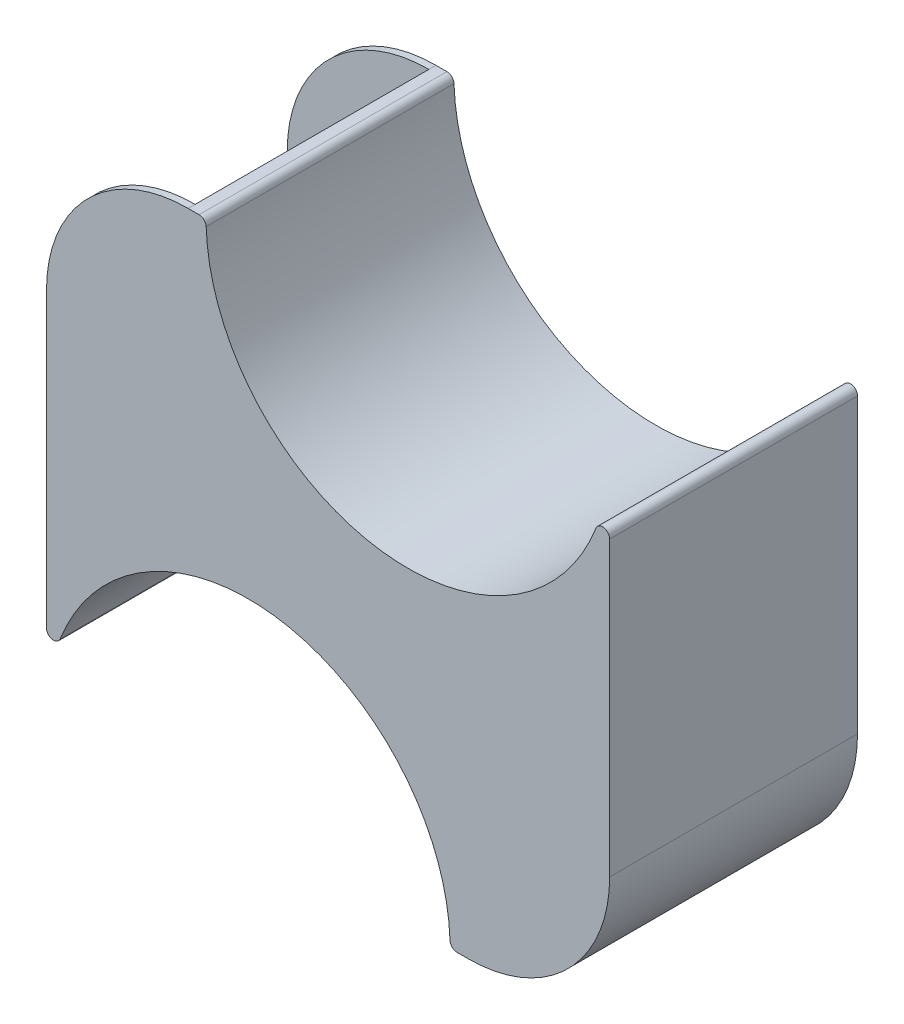
ISO-10303-21;
HEADER;
FILE_DESCRIPTION(('STEP AP214'),'2;1');
FILE_NAME('part.step','',(''),(''),'','','');
FILE_SCHEMA(('AUTOMOTIVE_DESIGN { 1 0 10303 214 1 1 1 1 }'));
ENDSEC;
DATA;
#1=APPLICATION_CONTEXT('core data for automotive mechanical design processes');
#2=APPLICATION_PROTOCOL_DEFINITION('international standard','automotive_design',2000,#1);
#3=PRODUCT_CONTEXT('',#1,'mechanical');
#4=PRODUCT('Part','Part','',(#3));
#5=PRODUCT_RELATED_PRODUCT_CATEGORY('part','',(#4));
#6=PRODUCT_DEFINITION_FORMATION('','',#4);
#7=PRODUCT_DEFINITION_CONTEXT('part definition',#1,'design');
#8=PRODUCT_DEFINITION('design','',#6,#7);
#9=PRODUCT_DEFINITION_SHAPE('','',#8);
#10=(LENGTH_UNIT() NAMED_UNIT(*) SI_UNIT(.MILLI.,.METRE.));
#11=(NAMED_UNIT(*) PLANE_ANGLE_UNIT() SI_UNIT($,.RADIAN.));
#12=(NAMED_UNIT(*) SI_UNIT($,.STERADIAN.) SOLID_ANGLE_UNIT());
#13=UNCERTAINTY_MEASURE_WITH_UNIT(LENGTH_MEASURE(1.E-05),#10,'distance_accuracy_value','');
#14=(GEOMETRIC_REPRESENTATION_CONTEXT(3) GLOBAL_UNCERTAINTY_ASSIGNED_CONTEXT((#13)) GLOBAL_UNIT_ASSIGNED_CONTEXT((#10,
#11,#12)) REPRESENTATION_CONTEXT('',''));
#15=CARTESIAN_POINT('',(0.,0.,0.));
#16=DIRECTION('',(0.,0.,1.));
#17=DIRECTION('',(1.,0.,0.));
#18=AXIS2_PLACEMENT_3D('',#15,#16,#17);
#19=CARTESIAN_POINT('',(-31.0300000000002,-20.,35.));
#20=DIRECTION('',(0.,0.,-1.));
#21=DIRECTION('',(-1.,0.,0.));
#22=AXIS2_PLACEMENT_3D('',#19,#20,#21);
#23=CYLINDRICAL_SURFACE('',#22,20.);
#24=DIRECTION('',(0.,0.,-1.));
#25=VECTOR('',#24,1.);
#26=CARTESIAN_POINT('',(-31.0300000000002,0.,35.));
#27=LINE('',#26,#25);
#28=CARTESIAN_POINT('',(-31.0300000000002,0.,34.));
#29=VERTEX_POINT('',#28);
#30=CARTESIAN_POINT('',(-31.0300000000002,0.,35.));
#31=VERTEX_POINT('',#30);
#32=EDGE_CURVE('E416',#29,#31,#27,.F.);
#33=ORIENTED_EDGE('',*,*,#32,.F.);
#34=CARTESIAN_POINT('',(-31.0300000000002,-20.,34.));
#35=DIRECTION('',(0.,0.,1.));
#36=DIRECTION('',(1.,0.,0.));
#37=AXIS2_PLACEMENT_3D('',#34,#35,#36);
#38=CIRCLE('',#37,20.);
#39=CARTESIAN_POINT('',(-51.0300000000002,-20.0000000000001,34.));
#40=VERTEX_POINT('',#39);
#41=EDGE_CURVE('E250',#29,#40,#38,.T.);
#42=ORIENTED_EDGE('',*,*,#41,.T.);
#43=DIRECTION('',(0.,0.,-1.));
#44=VECTOR('',#43,1.);
#45=CARTESIAN_POINT('',(-51.0300000000002,-20.0000000000001,35.));
#46=LINE('',#45,#44);
#47=CARTESIAN_POINT('',(-51.0300000000002,-20.0000000000001,35.));
#48=VERTEX_POINT('',#47);
#49=EDGE_CURVE('E406',#48,#40,#46,.T.);
#50=ORIENTED_EDGE('',*,*,#49,.F.);
#51=CARTESIAN_POINT('',(-31.0300000000002,-20.,35.));
#52=DIRECTION('',(0.,0.,1.));
#53=DIRECTION('',(1.,0.,0.));
#54=AXIS2_PLACEMENT_3D('',#51,#52,#53);
#55=CIRCLE('',#54,20.);
#56=EDGE_CURVE('E423',#31,#48,#55,.T.);
#57=ORIENTED_EDGE('',*,*,#56,.F.);
#58=EDGE_LOOP('',(#33,#42,#50,#57));
#59=FACE_BOUND('',#58,.T.);
#60=ADVANCED_FACE('F44',(#59),#23,.T.);
#61=CARTESIAN_POINT('',(-51.0300000000002,-20.0000000000001,1.));
#62=VERTEX_POINT('',#61);
#63=CARTESIAN_POINT('',(-51.0300000000002,-20.0000000000001,0.));
#64=VERTEX_POINT('',#63);
#65=EDGE_CURVE('E405',#62,#64,#46,.T.);
#66=ORIENTED_EDGE('',*,*,#65,.F.);
#67=CARTESIAN_POINT('',(-31.0300000000002,-20.,1.));
#68=DIRECTION('',(0.,0.,1.));
#69=DIRECTION('',(1.,0.,0.));
#70=AXIS2_PLACEMENT_3D('',#67,#68,#69);
#71=CIRCLE('',#70,20.);
#72=CARTESIAN_POINT('',(-31.0300000000002,0.,1.));
#73=VERTEX_POINT('',#72);
#74=EDGE_CURVE('E277',#62,#73,#71,.F.);
#75=ORIENTED_EDGE('',*,*,#74,.T.);
#76=CARTESIAN_POINT('',(-31.0300000000002,0.,0.));
#77=VERTEX_POINT('',#76);
#78=EDGE_CURVE('E417',#77,#73,#27,.F.);
#79=ORIENTED_EDGE('',*,*,#78,.F.);
#80=CARTESIAN_POINT('',(-31.0300000000002,-20.,0.));
#81=DIRECTION('',(0.,0.,1.));
#82=DIRECTION('',(1.,0.,0.));
#83=AXIS2_PLACEMENT_3D('',#80,#81,#82);
#84=CIRCLE('',#83,20.);
#85=EDGE_CURVE('E413',#64,#77,#84,.F.);
#86=ORIENTED_EDGE('',*,*,#85,.F.);
#87=EDGE_LOOP('',(#66,#75,#79,#86));
#88=FACE_BOUND('',#87,.T.);
#89=ADVANCED_FACE('F480',(#88),#23,.T.);
#90=CARTESIAN_POINT('',(0.,0.,35.));
#91=DIRECTION('',(0.,0.,-1.));
#92=DIRECTION('',(-1.,0.,0.));
#93=AXIS2_PLACEMENT_3D('',#90,#91,#92);
#94=CYLINDRICAL_SURFACE('',#93,28.5);
#95=CARTESIAN_POINT('',(0.,0.,0.));
#96=DIRECTION('',(0.,0.,-1.));
#97=DIRECTION('',(1.,0.,0.));
#98=AXIS2_PLACEMENT_3D('',#95,#96,#97);
#99=CIRCLE('',#98,28.5);
#100=CARTESIAN_POINT('',(26.5677966101695,-10.3151433960303,0.));
#101=VERTEX_POINT('',#100);
#102=CARTESIAN_POINT('',(-28.4836206883023,-0.966101694915254,0.));
#103=VERTEX_POINT('',#102);
#104=EDGE_CURVE('E290',#101,#103,#99,.T.);
#105=ORIENTED_EDGE('',*,*,#104,.T.);
#106=DIRECTION('',(0.,0.,-1.));
#107=VECTOR('',#106,1.);
#108=CARTESIAN_POINT('',(-28.4836206883023,-0.966101694915255,35.));
#109=LINE('',#108,#107);
#110=CARTESIAN_POINT('',(-28.4836206883023,-0.966101694915254,35.));
#111=VERTEX_POINT('',#110);
#112=EDGE_CURVE('E371',#103,#111,#109,.F.);
#113=ORIENTED_EDGE('',*,*,#112,.T.);
#114=CARTESIAN_POINT('',(0.,0.,35.));
#115=DIRECTION('',(0.,0.,-1.));
#116=DIRECTION('',(1.,0.,0.));
#117=AXIS2_PLACEMENT_3D('',#114,#115,#116);
#118=CIRCLE('',#117,28.5);
#119=CARTESIAN_POINT('',(26.5677966101695,-10.3151433960303,35.));
#120=VERTEX_POINT('',#119);
#121=EDGE_CURVE('E307',#120,#111,#118,.T.);
#122=ORIENTED_EDGE('',*,*,#121,.F.);
#123=DIRECTION('',(0.,0.,-1.));
#124=VECTOR('',#123,1.);
#125=CARTESIAN_POINT('',(26.5677966101695,-10.3151433960303,35.));
#126=LINE('',#125,#124);
#127=EDGE_CURVE('E367',#120,#101,#126,.T.);
#128=ORIENTED_EDGE('',*,*,#127,.T.);
#129=EDGE_LOOP('',(#105,#113,#122,#128));
#130=FACE_BOUND('',#129,.T.);
#131=ADVANCED_FACE('F446',(#130),#94,.F.);
#132=CARTESIAN_POINT('',(-28.5,0.,35.));
#133=DIRECTION('',(0.,-1.,0.));
#134=DIRECTION('',(1.,0.,0.));
#135=AXIS2_PLACEMENT_3D('',#132,#133,#134);
#136=PLANE('',#135);
#137=DIRECTION('',(-1.,0.,0.));
#138=VECTOR('',#137,1.);
#139=CARTESIAN_POINT('',(-28.5,0.,0.));
#140=LINE('',#139,#138);
#141=CARTESIAN_POINT('',(-29.4830459756111,0.,0.));
#142=VERTEX_POINT('',#141);
#143=EDGE_CURVE('E333',#142,#77,#140,.T.);
#144=ORIENTED_EDGE('',*,*,#143,.T.);
#145=ORIENTED_EDGE('',*,*,#78,.T.);
#146=DIRECTION('',(0.,0.,-1.));
#147=VECTOR('',#146,1.);
#148=CARTESIAN_POINT('',(-31.0300000000002,0.,35.));
#149=LINE('',#148,#147);
#150=EDGE_CURVE('E251',#73,#29,#149,.F.);
#151=ORIENTED_EDGE('',*,*,#150,.T.);
#152=ORIENTED_EDGE('',*,*,#32,.T.);
#153=DIRECTION('',(-1.,0.,0.));
#154=VECTOR('',#153,1.);
#155=CARTESIAN_POINT('',(-28.5,0.,35.));
#156=LINE('',#155,#154);
#157=CARTESIAN_POINT('',(-29.4830459756111,0.,35.));
#158=VERTEX_POINT('',#157);
#159=EDGE_CURVE('E311',#158,#31,#156,.T.);
#160=ORIENTED_EDGE('',*,*,#159,.F.);
#161=DIRECTION('',(0.,0.,-1.));
#162=VECTOR('',#161,1.);
#163=CARTESIAN_POINT('',(-29.4830459756111,0.,35.));
#164=LINE('',#163,#162);
#165=EDGE_CURVE('E329',#158,#142,#164,.T.);
#166=ORIENTED_EDGE('',*,*,#165,.T.);
#167=EDGE_LOOP('',(#144,#145,#151,#152,#160,#166));
#168=FACE_BOUND('',#167,.T.);
#169=ADVANCED_FACE('F454',(#168),#136,.F.);
#170=CARTESIAN_POINT('',(-51.0300000000003,0.,35.));
#171=DIRECTION('',(1.,0.,0.));
#172=DIRECTION('',(0.,1.,0.));
#173=AXIS2_PLACEMENT_3D('',#170,#171,#172);
#174=PLANE('',#173);
#175=DIRECTION('',(0.,-1.,0.));
#176=VECTOR('',#175,1.);
#177=CARTESIAN_POINT('',(-51.0300000000003,0.,35.));
#178=LINE('',#177,#176);
#179=CARTESIAN_POINT('',(-51.03,-61.3229217479688,35.));
#180=VERTEX_POINT('',#179);
#181=EDGE_CURVE('E316',#48,#180,#178,.T.);
#182=ORIENTED_EDGE('',*,*,#181,.F.);
#183=ORIENTED_EDGE('',*,*,#49,.T.);
#184=DIRECTION('',(0.,0.,-1.));
#185=VECTOR('',#184,1.);
#186=CARTESIAN_POINT('',(-51.0300000000002,-20.0000000000001,35.));
#187=LINE('',#186,#185);
#188=EDGE_CURVE('E278',#40,#62,#187,.T.);
#189=ORIENTED_EDGE('',*,*,#188,.T.);
#190=ORIENTED_EDGE('',*,*,#65,.T.);
#191=DIRECTION('',(0.,-1.,0.));
#192=VECTOR('',#191,1.);
#193=CARTESIAN_POINT('',(-51.0300000000003,0.,0.));
#194=LINE('',#193,#192);
#195=CARTESIAN_POINT('',(-51.03,-61.3229217479688,0.));
#196=VERTEX_POINT('',#195);
#197=EDGE_CURVE('E337',#64,#196,#194,.T.);
#198=ORIENTED_EDGE('',*,*,#197,.T.);
#199=DIRECTION('',(0.,0.,-1.));
#200=VECTOR('',#199,1.);
#201=CARTESIAN_POINT('',(-51.03,-61.3229217479688,35.));
#202=LINE('',#201,#200);
#203=EDGE_CURVE('E397',#196,#180,#202,.F.);
#204=ORIENTED_EDGE('',*,*,#203,.T.);
#205=EDGE_LOOP('',(#182,#183,#189,#190,#198,#204));
#206=FACE_BOUND('',#205,.T.);
#207=ADVANCED_FACE('F486',(#206),#174,.F.);
#208=CARTESIAN_POINT('',(-22.53,-72.,35.));
#209=DIRECTION('',(0.,0.,-1.));
#210=DIRECTION('',(-1.,0.,0.));
#211=AXIS2_PLACEMENT_3D('',#208,#209,#210);
#212=CYLINDRICAL_SURFACE('',#211,28.5);
#213=CARTESIAN_POINT('',(-22.53,-72.,0.));
#214=DIRECTION('',(0.,0.,-1.));
#215=DIRECTION('',(1.,0.,0.));
#216=AXIS2_PLACEMENT_3D('',#213,#214,#215);
#217=CIRCLE('',#216,28.5);
#218=CARTESIAN_POINT('',(-49.0977966101695,-61.6848566039698,0.));
#219=VERTEX_POINT('',#218);
#220=CARTESIAN_POINT('',(5.9536206883023,-71.0338983050847,0.));
#221=VERTEX_POINT('',#220);
#222=EDGE_CURVE('E340',#219,#221,#217,.T.);
#223=ORIENTED_EDGE('',*,*,#222,.T.);
#224=DIRECTION('',(0.,0.,-1.));
#225=VECTOR('',#224,1.);
#226=CARTESIAN_POINT('',(5.9536206883023,-71.0338983050847,35.));
#227=LINE('',#226,#225);
#228=CARTESIAN_POINT('',(5.9536206883023,-71.0338983050847,35.));
#229=VERTEX_POINT('',#228);
#230=EDGE_CURVE('E394',#221,#229,#227,.F.);
#231=ORIENTED_EDGE('',*,*,#230,.T.);
#232=CARTESIAN_POINT('',(-22.53,-72.,35.));
#233=DIRECTION('',(0.,0.,-1.));
#234=DIRECTION('',(1.,0.,0.));
#235=AXIS2_PLACEMENT_3D('',#232,#233,#234);
#236=CIRCLE('',#235,28.5);
#237=CARTESIAN_POINT('',(-49.0977966101695,-61.6848566039698,35.));
#238=VERTEX_POINT('',#237);
#239=EDGE_CURVE('E319',#238,#229,#236,.T.);
#240=ORIENTED_EDGE('',*,*,#239,.F.);
#241=DIRECTION('',(0.,0.,-1.));
#242=VECTOR('',#241,1.);
#243=CARTESIAN_POINT('',(-49.0977966101695,-61.6848566039698,35.));
#244=LINE('',#243,#242);
#245=EDGE_CURVE('E390',#238,#219,#244,.T.);
#246=ORIENTED_EDGE('',*,*,#245,.T.);
#247=EDGE_LOOP('',(#223,#231,#240,#246));
#248=FACE_BOUND('',#247,.T.);
#249=ADVANCED_FACE('F497',(#248),#212,.F.);
#250=CARTESIAN_POINT('',(5.97000000000001,-72.,35.));
#251=DIRECTION('',(0.,1.,0.));
#252=DIRECTION('',(0.,0.,1.));
#253=AXIS2_PLACEMENT_3D('',#250,#251,#252);
#254=PLANE('',#253);
#255=DIRECTION('',(1.,0.,0.));
#256=VECTOR('',#255,1.);
#257=CARTESIAN_POINT('',(5.97000000000001,-72.,0.));
#258=LINE('',#257,#256);
#259=CARTESIAN_POINT('',(6.95304597561116,-72.,0.));
#260=VERTEX_POINT('',#259);
#261=CARTESIAN_POINT('',(8.5,-72.,0.));
#262=VERTEX_POINT('',#261);
#263=EDGE_CURVE('E344',#260,#262,#258,.T.);
#264=ORIENTED_EDGE('',*,*,#263,.T.);
#265=DIRECTION('',(0.,0.,-1.));
#266=VECTOR('',#265,1.);
#267=CARTESIAN_POINT('',(8.5,-72.,35.));
#268=LINE('',#267,#266);
#269=CARTESIAN_POINT('',(8.5,-72.,35.));
#270=VERTEX_POINT('',#269);
#271=EDGE_CURVE('E11',#262,#270,#268,.F.);
#272=ORIENTED_EDGE('',*,*,#271,.T.);
#273=DIRECTION('',(1.,0.,0.));
#274=VECTOR('',#273,1.);
#275=CARTESIAN_POINT('',(5.97000000000001,-72.,35.));
#276=LINE('',#275,#274);
#277=CARTESIAN_POINT('',(6.95304597561116,-72.,35.));
#278=VERTEX_POINT('',#277);
#279=EDGE_CURVE('E323',#278,#270,#276,.T.);
#280=ORIENTED_EDGE('',*,*,#279,.F.);
#281=DIRECTION('',(0.,0.,-1.));
#282=VECTOR('',#281,1.);
#283=CARTESIAN_POINT('',(6.95304597561116,-72.,35.));
#284=LINE('',#283,#282);
#285=EDGE_CURVE('E386',#278,#260,#284,.T.);
#286=ORIENTED_EDGE('',*,*,#285,.T.);
#287=EDGE_LOOP('',(#264,#272,#280,#286));
#288=FACE_BOUND('',#287,.T.);
#289=ADVANCED_FACE('F541',(#288),#254,.F.);
#290=CARTESIAN_POINT('',(28.5,-72.,35.));
#291=DIRECTION('',(-1.,0.,0.));
#292=DIRECTION('',(0.,0.,1.));
#293=AXIS2_PLACEMENT_3D('',#290,#291,#292);
#294=PLANE('',#293);
#295=DIRECTION('',(0.,1.,0.));
#296=VECTOR('',#295,1.);
#297=CARTESIAN_POINT('',(28.5,-72.,35.));
#298=LINE('',#297,#296);
#299=CARTESIAN_POINT('',(28.5,-52.,35.));
#300=VERTEX_POINT('',#299);
#301=CARTESIAN_POINT('',(28.5,-10.6770782520313,35.));
#302=VERTEX_POINT('',#301);
#303=EDGE_CURVE('E326',#300,#302,#298,.T.);
#304=ORIENTED_EDGE('',*,*,#303,.F.);
#305=DIRECTION('',(0.,0.,-1.));
#306=VECTOR('',#305,1.);
#307=CARTESIAN_POINT('',(28.5,-52.,35.));
#308=LINE('',#307,#306);
#309=CARTESIAN_POINT('',(28.5,-52.,0.));
#310=VERTEX_POINT('',#309);
#311=EDGE_CURVE('E53',#300,#310,#308,.T.);
#312=ORIENTED_EDGE('',*,*,#311,.T.);
#313=DIRECTION('',(0.,1.,0.));
#314=VECTOR('',#313,1.);
#315=CARTESIAN_POINT('',(28.5,-72.,0.));
#316=LINE('',#315,#314);
#317=CARTESIAN_POINT('',(28.5,-10.6770782520313,0.));
#318=VERTEX_POINT('',#317);
#319=EDGE_CURVE('E312',#310,#318,#316,.T.);
#320=ORIENTED_EDGE('',*,*,#319,.T.);
#321=DIRECTION('',(0.,0.,-1.));
#322=VECTOR('',#321,1.);
#323=CARTESIAN_POINT('',(28.5,-10.6770782520313,35.));
#324=LINE('',#323,#322);
#325=EDGE_CURVE('E401',#318,#302,#324,.F.);
#326=ORIENTED_EDGE('',*,*,#325,.T.);
#327=EDGE_LOOP('',(#304,#312,#320,#326));
#328=FACE_BOUND('',#327,.T.);
#329=ADVANCED_FACE('F430',(#328),#294,.F.);
#330=CARTESIAN_POINT('',(0.,0.,35.));
#331=DIRECTION('',(0.,0.,1.));
#332=DIRECTION('',(1.,0.,0.));
#333=AXIS2_PLACEMENT_3D('',#330,#331,#332);
#334=PLANE('',#333);
#335=ORIENTED_EDGE('',*,*,#159,.T.);
#336=ORIENTED_EDGE('',*,*,#56,.T.);
#337=ORIENTED_EDGE('',*,*,#181,.T.);
#338=CARTESIAN_POINT('',(-50.03,-61.3229217479688,35.));
#339=DIRECTION('',(0.,0.,1.));
#340=DIRECTION('',(1.,0.,0.));
#341=AXIS2_PLACEMENT_3D('',#338,#339,#340);
#342=CIRCLE('',#341,1.);
#343=EDGE_CURVE('E377',#180,#238,#342,.T.);
#344=ORIENTED_EDGE('',*,*,#343,.T.);
#345=ORIENTED_EDGE('',*,*,#239,.T.);
#346=CARTESIAN_POINT('',(6.95304597561116,-71.,35.));
#347=DIRECTION('',(0.,0.,1.));
#348=DIRECTION('',(1.,0.,0.));
#349=AXIS2_PLACEMENT_3D('',#346,#347,#348);
#350=CIRCLE('',#349,1.);
#351=EDGE_CURVE('E380',#229,#278,#350,.T.);
#352=ORIENTED_EDGE('',*,*,#351,.T.);
#353=ORIENTED_EDGE('',*,*,#279,.T.);
#354=CARTESIAN_POINT('',(8.5,-52.,35.));
#355=DIRECTION('',(0.,0.,1.));
#356=DIRECTION('',(1.,0.,0.));
#357=AXIS2_PLACEMENT_3D('',#354,#355,#356);
#358=CIRCLE('',#357,20.);
#359=EDGE_CURVE('E68',#270,#300,#358,.T.);
#360=ORIENTED_EDGE('',*,*,#359,.T.);
#361=ORIENTED_EDGE('',*,*,#303,.T.);
#362=CARTESIAN_POINT('',(27.5,-10.6770782520313,35.));
#363=DIRECTION('',(0.,0.,1.));
#364=DIRECTION('',(1.,0.,0.));
#365=AXIS2_PLACEMENT_3D('',#362,#363,#364);
#366=CIRCLE('',#365,1.);
#367=EDGE_CURVE('E374',#302,#120,#366,.T.);
#368=ORIENTED_EDGE('',*,*,#367,.T.);
#369=ORIENTED_EDGE('',*,*,#121,.T.);
#370=CARTESIAN_POINT('',(-29.4830459756111,-1.,35.));
#371=DIRECTION('',(0.,0.,1.));
#372=DIRECTION('',(1.,0.,0.));
#373=AXIS2_PLACEMENT_3D('',#370,#371,#372);
#374=CIRCLE('',#373,1.);
#375=EDGE_CURVE('E383',#111,#158,#374,.T.);
#376=ORIENTED_EDGE('',*,*,#375,.T.);
#377=EDGE_LOOP('',(#335,#336,#337,#344,#345,#352,#353,#360,#361,#368,#369,#376));
#378=FACE_BOUND('',#377,.T.);
#379=ADVANCED_FACE('F443',(#378),#334,.T.);
#380=CARTESIAN_POINT('',(0.,0.,0.));
#381=DIRECTION('',(0.,0.,1.));
#382=DIRECTION('',(1.,0.,0.));
#383=AXIS2_PLACEMENT_3D('',#380,#381,#382);
#384=PLANE('',#383);
#385=ORIENTED_EDGE('',*,*,#197,.F.);
#386=ORIENTED_EDGE('',*,*,#85,.T.);
#387=ORIENTED_EDGE('',*,*,#143,.F.);
#388=CARTESIAN_POINT('',(-29.4830459756111,-1.,0.));
#389=DIRECTION('',(0.,0.,1.));
#390=DIRECTION('',(1.,0.,0.));
#391=AXIS2_PLACEMENT_3D('',#388,#389,#390);
#392=CIRCLE('',#391,1.);
#393=EDGE_CURVE('E364',#142,#103,#392,.F.);
#394=ORIENTED_EDGE('',*,*,#393,.T.);
#395=ORIENTED_EDGE('',*,*,#104,.F.);
#396=CARTESIAN_POINT('',(27.5,-10.6770782520313,0.));
#397=DIRECTION('',(0.,0.,1.));
#398=DIRECTION('',(1.,0.,0.));
#399=AXIS2_PLACEMENT_3D('',#396,#397,#398);
#400=CIRCLE('',#399,1.);
#401=EDGE_CURVE('E353',#101,#318,#400,.F.);
#402=ORIENTED_EDGE('',*,*,#401,.T.);
#403=ORIENTED_EDGE('',*,*,#319,.F.);
#404=CARTESIAN_POINT('',(8.5,-52.,0.));
#405=DIRECTION('',(0.,0.,1.));
#406=DIRECTION('',(1.,0.,0.));
#407=AXIS2_PLACEMENT_3D('',#404,#405,#406);
#408=CIRCLE('',#407,20.);
#409=EDGE_CURVE('E410',#310,#262,#408,.F.);
#410=ORIENTED_EDGE('',*,*,#409,.T.);
#411=ORIENTED_EDGE('',*,*,#263,.F.);
#412=CARTESIAN_POINT('',(6.95304597561116,-71.,0.));
#413=DIRECTION('',(0.,0.,1.));
#414=DIRECTION('',(1.,0.,0.));
#415=AXIS2_PLACEMENT_3D('',#412,#413,#414);
#416=CIRCLE('',#415,1.);
#417=EDGE_CURVE('E361',#260,#221,#416,.F.);
#418=ORIENTED_EDGE('',*,*,#417,.T.);
#419=ORIENTED_EDGE('',*,*,#222,.F.);
#420=CARTESIAN_POINT('',(-50.03,-61.3229217479688,0.));
#421=DIRECTION('',(0.,0.,1.));
#422=DIRECTION('',(1.,0.,0.));
#423=AXIS2_PLACEMENT_3D('',#420,#421,#422);
#424=CIRCLE('',#423,1.);
#425=EDGE_CURVE('E357',#219,#196,#424,.F.);
#426=ORIENTED_EDGE('',*,*,#425,.T.);
#427=EDGE_LOOP('',(#385,#386,#387,#394,#395,#402,#403,#410,#411,#418,#419,#426));
#428=FACE_BOUND('',#427,.T.);
#429=ADVANCED_FACE('F434',(#428),#384,.F.);
#430=CARTESIAN_POINT('',(-29.4830459756111,-1.,35.));
#431=DIRECTION('',(0.,0.,-1.));
#432=DIRECTION('',(-1.,0.,0.));
#433=AXIS2_PLACEMENT_3D('',#430,#431,#432);
#434=CYLINDRICAL_SURFACE('',#433,1.);
#435=ORIENTED_EDGE('',*,*,#375,.F.);
#436=ORIENTED_EDGE('',*,*,#112,.F.);
#437=ORIENTED_EDGE('',*,*,#393,.F.);
#438=ORIENTED_EDGE('',*,*,#165,.F.);
#439=EDGE_LOOP('',(#435,#436,#437,#438));
#440=FACE_BOUND('',#439,.T.);
#441=ADVANCED_FACE('F449',(#440),#434,.T.);
#442=CARTESIAN_POINT('',(6.95304597561116,-71.,35.));
#443=DIRECTION('',(0.,0.,-1.));
#444=DIRECTION('',(-1.,0.,0.));
#445=AXIS2_PLACEMENT_3D('',#442,#443,#444);
#446=CYLINDRICAL_SURFACE('',#445,1.);
#447=ORIENTED_EDGE('',*,*,#351,.F.);
#448=ORIENTED_EDGE('',*,*,#230,.F.);
#449=ORIENTED_EDGE('',*,*,#417,.F.);
#450=ORIENTED_EDGE('',*,*,#285,.F.);
#451=EDGE_LOOP('',(#447,#448,#449,#450));
#452=FACE_BOUND('',#451,.T.);
#453=ADVANCED_FACE('F501',(#452),#446,.T.);
#454=CARTESIAN_POINT('',(-50.03,-61.3229217479688,35.));
#455=DIRECTION('',(0.,0.,-1.));
#456=DIRECTION('',(-1.,0.,0.));
#457=AXIS2_PLACEMENT_3D('',#454,#455,#456);
#458=CYLINDRICAL_SURFACE('',#457,1.);
#459=ORIENTED_EDGE('',*,*,#343,.F.);
#460=ORIENTED_EDGE('',*,*,#203,.F.);
#461=ORIENTED_EDGE('',*,*,#425,.F.);
#462=ORIENTED_EDGE('',*,*,#245,.F.);
#463=EDGE_LOOP('',(#459,#460,#461,#462));
#464=FACE_BOUND('',#463,.T.);
#465=ADVANCED_FACE('F499',(#464),#458,.T.);
#466=CARTESIAN_POINT('',(27.5,-10.6770782520313,35.));
#467=DIRECTION('',(0.,0.,-1.));
#468=DIRECTION('',(-1.,0.,0.));
#469=AXIS2_PLACEMENT_3D('',#466,#467,#468);
#470=CYLINDRICAL_SURFACE('',#469,1.);
#471=ORIENTED_EDGE('',*,*,#367,.F.);
#472=ORIENTED_EDGE('',*,*,#325,.F.);
#473=ORIENTED_EDGE('',*,*,#401,.F.);
#474=ORIENTED_EDGE('',*,*,#127,.F.);
#475=EDGE_LOOP('',(#471,#472,#473,#474));
#476=FACE_BOUND('',#475,.T.);
#477=ADVANCED_FACE('F441',(#476),#470,.T.);
#478=CARTESIAN_POINT('',(8.5,-52.,35.));
#479=DIRECTION('',(0.,0.,-1.));
#480=DIRECTION('',(-1.,0.,0.));
#481=AXIS2_PLACEMENT_3D('',#478,#479,#480);
#482=CYLINDRICAL_SURFACE('',#481,20.);
#483=ORIENTED_EDGE('',*,*,#359,.F.);
#484=ORIENTED_EDGE('',*,*,#271,.F.);
#485=ORIENTED_EDGE('',*,*,#409,.F.);
#486=ORIENTED_EDGE('',*,*,#311,.F.);
#487=EDGE_LOOP('',(#483,#484,#485,#486));
#488=FACE_BOUND('',#487,.T.);
#489=ADVANCED_FACE('F46',(#488),#482,.T.);
#490=CARTESIAN_POINT('',(-51.0300000000002,-20.0000000000001,17.5));
#491=DIRECTION('',(0.,1.,0.));
#492=DIRECTION('',(0.,0.,-1.));
#493=AXIS2_PLACEMENT_3D('',#490,#491,#492);
#494=PLANE('',#493);
#495=ORIENTED_EDGE('',*,*,#188,.F.);
#496=DIRECTION('',(1.,0.,0.));
#497=VECTOR('',#496,1.);
#498=CARTESIAN_POINT('',(-51.0300000000002,-20.0000000000001,34.));
#499=LINE('',#498,#497);
#500=CARTESIAN_POINT('',(-50.0300000000002,-20.0000000000001,34.));
#501=VERTEX_POINT('',#500);
#502=EDGE_CURVE('E291',#501,#40,#499,.F.);
#503=ORIENTED_EDGE('',*,*,#502,.F.);
#504=DIRECTION('',(0.,0.,1.));
#505=VECTOR('',#504,1.);
#506=CARTESIAN_POINT('',(-50.0300000000002,-20.0000000000001,35.));
#507=LINE('',#506,#505);
#508=CARTESIAN_POINT('',(-50.0300000000002,-20.0000000000001,1.));
#509=VERTEX_POINT('',#508);
#510=EDGE_CURVE('E284',#501,#509,#507,.F.);
#511=ORIENTED_EDGE('',*,*,#510,.T.);
#512=DIRECTION('',(1.,0.,0.));
#513=VECTOR('',#512,1.);
#514=CARTESIAN_POINT('',(-51.0300000000002,-20.0000000000001,1.));
#515=LINE('',#514,#513);
#516=EDGE_CURVE('E60',#509,#62,#515,.F.);
#517=ORIENTED_EDGE('',*,*,#516,.T.);
#518=EDGE_LOOP('',(#495,#503,#511,#517));
#519=FACE_BOUND('',#518,.T.);
#520=ADVANCED_FACE('F489',(#519),#494,.T.);
#521=CARTESIAN_POINT('',(-31.0300000000002,0.,17.5));
#522=DIRECTION('',(1.,0.,0.));
#523=DIRECTION('',(0.,0.,-1.));
#524=AXIS2_PLACEMENT_3D('',#521,#522,#523);
#525=PLANE('',#524);
#526=ORIENTED_EDGE('',*,*,#150,.F.);
#527=DIRECTION('',(0.,-1.,0.));
#528=VECTOR('',#527,1.);
#529=CARTESIAN_POINT('',(-31.0300000000002,0.,1.));
#530=LINE('',#529,#528);
#531=CARTESIAN_POINT('',(-31.0300000000002,-1.,1.));
#532=VERTEX_POINT('',#531);
#533=EDGE_CURVE('E294',#532,#73,#530,.F.);
#534=ORIENTED_EDGE('',*,*,#533,.F.);
#535=DIRECTION('',(0.,0.,1.));
#536=VECTOR('',#535,1.);
#537=CARTESIAN_POINT('',(-31.0300000000002,-1.,35.));
#538=LINE('',#537,#536);
#539=CARTESIAN_POINT('',(-31.0300000000002,-1.,34.));
#540=VERTEX_POINT('',#539);
#541=EDGE_CURVE('E221',#532,#540,#538,.T.);
#542=ORIENTED_EDGE('',*,*,#541,.T.);
#543=DIRECTION('',(0.,1.,0.));
#544=VECTOR('',#543,1.);
#545=CARTESIAN_POINT('',(-31.0300000000002,0.,34.));
#546=LINE('',#545,#544);
#547=EDGE_CURVE('E298',#540,#29,#546,.T.);
#548=ORIENTED_EDGE('',*,*,#547,.T.);
#549=EDGE_LOOP('',(#526,#534,#542,#548));
#550=FACE_BOUND('',#549,.T.);
#551=ADVANCED_FACE('F476',(#550),#525,.F.);
#552=CARTESIAN_POINT('',(0.,0.,35.));
#553=DIRECTION('',(0.,0.,-1.));
#554=DIRECTION('',(-1.,0.,0.));
#555=AXIS2_PLACEMENT_3D('',#552,#553,#554);
#556=CYLINDRICAL_SURFACE('',#555,29.5);
#557=CARTESIAN_POINT('',(0.,0.,1.));
#558=DIRECTION('',(0.,0.,1.));
#559=DIRECTION('',(1.,0.,0.));
#560=AXIS2_PLACEMENT_3D('',#557,#558,#559);
#561=CIRCLE('',#560,29.5);
#562=CARTESIAN_POINT('',(27.5,-10.6770782520313,1.));
#563=VERTEX_POINT('',#562);
#564=CARTESIAN_POINT('',(-29.4830459756111,-1.,1.));
#565=VERTEX_POINT('',#564);
#566=EDGE_CURVE('E194',#563,#565,#561,.F.);
#567=ORIENTED_EDGE('',*,*,#566,.F.);
#568=DIRECTION('',(0.,0.,-1.));
#569=VECTOR('',#568,1.);
#570=CARTESIAN_POINT('',(27.5,-10.6770782520313,1.));
#571=LINE('',#570,#569);
#572=CARTESIAN_POINT('',(27.5,-10.6770782520313,34.));
#573=VERTEX_POINT('',#572);
#574=EDGE_CURVE('E230',#563,#573,#571,.F.);
#575=ORIENTED_EDGE('',*,*,#574,.T.);
#576=CARTESIAN_POINT('',(0.,0.,34.));
#577=DIRECTION('',(0.,0.,1.));
#578=DIRECTION('',(1.,0.,0.));
#579=AXIS2_PLACEMENT_3D('',#576,#577,#578);
#580=CIRCLE('',#579,29.5);
#581=CARTESIAN_POINT('',(-29.4830459756111,-1.,34.));
#582=VERTEX_POINT('',#581);
#583=EDGE_CURVE('E211',#573,#582,#580,.F.);
#584=ORIENTED_EDGE('',*,*,#583,.T.);
#585=DIRECTION('',(0.,0.,-1.));
#586=VECTOR('',#585,1.);
#587=CARTESIAN_POINT('',(-29.4830459756111,-1.,1.));
#588=LINE('',#587,#586);
#589=EDGE_CURVE('E209',#565,#582,#588,.F.);
#590=ORIENTED_EDGE('',*,*,#589,.F.);
#591=EDGE_LOOP('',(#567,#575,#584,#590));
#592=FACE_BOUND('',#591,.T.);
#593=ADVANCED_FACE('F210',(#592),#556,.T.);
#594=CARTESIAN_POINT('',(-28.5,-1.,35.));
#595=DIRECTION('',(0.,-1.,0.));
#596=DIRECTION('',(1.,0.,0.));
#597=AXIS2_PLACEMENT_3D('',#594,#595,#596);
#598=PLANE('',#597);
#599=DIRECTION('',(-1.,0.,0.));
#600=VECTOR('',#599,1.);
#601=CARTESIAN_POINT('',(-28.5,-1.,1.));
#602=LINE('',#601,#600);
#603=EDGE_CURVE('E199',#565,#532,#602,.T.);
#604=ORIENTED_EDGE('',*,*,#603,.F.);
#605=ORIENTED_EDGE('',*,*,#589,.T.);
#606=DIRECTION('',(-1.,0.,0.));
#607=VECTOR('',#606,1.);
#608=CARTESIAN_POINT('',(-28.5,-1.,34.));
#609=LINE('',#608,#607);
#610=EDGE_CURVE('E232',#582,#540,#609,.T.);
#611=ORIENTED_EDGE('',*,*,#610,.T.);
#612=ORIENTED_EDGE('',*,*,#541,.F.);
#613=EDGE_LOOP('',(#604,#605,#611,#612));
#614=FACE_BOUND('',#613,.T.);
#615=ADVANCED_FACE('F219',(#614),#598,.T.);
#616=CARTESIAN_POINT('',(-50.0300000000003,0.,35.));
#617=DIRECTION('',(1.,0.,0.));
#618=DIRECTION('',(0.,1.,0.));
#619=AXIS2_PLACEMENT_3D('',#616,#617,#618);
#620=PLANE('',#619);
#621=DIRECTION('',(0.,-1.,0.));
#622=VECTOR('',#621,1.);
#623=CARTESIAN_POINT('',(-50.0300000000003,0.,34.));
#624=LINE('',#623,#622);
#625=CARTESIAN_POINT('',(-50.03,-61.3229217479688,34.));
#626=VERTEX_POINT('',#625);
#627=EDGE_CURVE('E235',#501,#626,#624,.T.);
#628=ORIENTED_EDGE('',*,*,#627,.T.);
#629=DIRECTION('',(0.,0.,-1.));
#630=VECTOR('',#629,1.);
#631=CARTESIAN_POINT('',(-50.03,-61.3229217479688,1.));
#632=LINE('',#631,#630);
#633=CARTESIAN_POINT('',(-50.03,-61.3229217479688,1.));
#634=VERTEX_POINT('',#633);
#635=EDGE_CURVE('E255',#634,#626,#632,.F.);
#636=ORIENTED_EDGE('',*,*,#635,.F.);
#637=DIRECTION('',(0.,-1.,0.));
#638=VECTOR('',#637,1.);
#639=CARTESIAN_POINT('',(-50.0300000000003,0.,1.));
#640=LINE('',#639,#638);
#641=EDGE_CURVE('E223',#509,#634,#640,.T.);
#642=ORIENTED_EDGE('',*,*,#641,.F.);
#643=ORIENTED_EDGE('',*,*,#510,.F.);
#644=EDGE_LOOP('',(#628,#636,#642,#643));
#645=FACE_BOUND('',#644,.T.);
#646=ADVANCED_FACE('F586',(#645),#620,.T.);
#647=CARTESIAN_POINT('',(-22.53,-72.,35.));
#648=DIRECTION('',(0.,0.,-1.));
#649=DIRECTION('',(-1.,0.,0.));
#650=AXIS2_PLACEMENT_3D('',#647,#648,#649);
#651=CYLINDRICAL_SURFACE('',#650,29.5);
#652=CARTESIAN_POINT('',(-22.53,-72.,1.));
#653=DIRECTION('',(0.,0.,1.));
#654=DIRECTION('',(1.,0.,0.));
#655=AXIS2_PLACEMENT_3D('',#652,#653,#654);
#656=CIRCLE('',#655,29.5);
#657=CARTESIAN_POINT('',(6.95304597561115,-71.,1.));
#658=VERTEX_POINT('',#657);
#659=EDGE_CURVE('E226',#634,#658,#656,.F.);
#660=ORIENTED_EDGE('',*,*,#659,.F.);
#661=ORIENTED_EDGE('',*,*,#635,.T.);
#662=CARTESIAN_POINT('',(-22.53,-72.,34.));
#663=DIRECTION('',(0.,0.,1.));
#664=DIRECTION('',(1.,0.,0.));
#665=AXIS2_PLACEMENT_3D('',#662,#663,#664);
#666=CIRCLE('',#665,29.5);
#667=CARTESIAN_POINT('',(6.95304597561115,-71.,34.));
#668=VERTEX_POINT('',#667);
#669=EDGE_CURVE('E239',#626,#668,#666,.F.);
#670=ORIENTED_EDGE('',*,*,#669,.T.);
#671=DIRECTION('',(0.,0.,-1.));
#672=VECTOR('',#671,1.);
#673=CARTESIAN_POINT('',(6.95304597561115,-71.,1.));
#674=LINE('',#673,#672);
#675=EDGE_CURVE('E215',#658,#668,#674,.F.);
#676=ORIENTED_EDGE('',*,*,#675,.F.);
#677=EDGE_LOOP('',(#660,#661,#670,#676));
#678=FACE_BOUND('',#677,.T.);
#679=ADVANCED_FACE('F594',(#678),#651,.T.);
#680=CARTESIAN_POINT('',(5.97000000000001,-71.,35.));
#681=DIRECTION('',(0.,1.,0.));
#682=DIRECTION('',(0.,0.,1.));
#683=AXIS2_PLACEMENT_3D('',#680,#681,#682);
#684=PLANE('',#683);
#685=DIRECTION('',(1.,0.,0.));
#686=VECTOR('',#685,1.);
#687=CARTESIAN_POINT('',(5.97000000000001,-71.,1.));
#688=LINE('',#687,#686);
#689=CARTESIAN_POINT('',(8.5,-71.,1.));
#690=VERTEX_POINT('',#689);
#691=EDGE_CURVE('E261',#658,#690,#688,.T.);
#692=ORIENTED_EDGE('',*,*,#691,.F.);
#693=ORIENTED_EDGE('',*,*,#675,.T.);
#694=DIRECTION('',(1.,0.,0.));
#695=VECTOR('',#694,1.);
#696=CARTESIAN_POINT('',(5.97000000000001,-71.,34.));
#697=LINE('',#696,#695);
#698=CARTESIAN_POINT('',(8.5,-71.,34.));
#699=VERTEX_POINT('',#698);
#700=EDGE_CURVE('E243',#668,#699,#697,.T.);
#701=ORIENTED_EDGE('',*,*,#700,.T.);
#702=DIRECTION('',(0.,0.,1.));
#703=VECTOR('',#702,1.);
#704=CARTESIAN_POINT('',(8.5,-71.,35.));
#705=LINE('',#704,#703);
#706=EDGE_CURVE('E268',#690,#699,#705,.T.);
#707=ORIENTED_EDGE('',*,*,#706,.F.);
#708=EDGE_LOOP('',(#692,#693,#701,#707));
#709=FACE_BOUND('',#708,.T.);
#710=ADVANCED_FACE('F603',(#709),#684,.T.);
#711=CARTESIAN_POINT('',(27.5,-72.,35.));
#712=DIRECTION('',(-1.,0.,0.));
#713=DIRECTION('',(0.,0.,1.));
#714=AXIS2_PLACEMENT_3D('',#711,#712,#713);
#715=PLANE('',#714);
#716=DIRECTION('',(0.,1.,0.));
#717=VECTOR('',#716,1.);
#718=CARTESIAN_POINT('',(27.5,-72.,34.));
#719=LINE('',#718,#717);
#720=CARTESIAN_POINT('',(27.5,-52.,34.));
#721=VERTEX_POINT('',#720);
#722=EDGE_CURVE('E216',#721,#573,#719,.T.);
#723=ORIENTED_EDGE('',*,*,#722,.T.);
#724=ORIENTED_EDGE('',*,*,#574,.F.);
#725=DIRECTION('',(0.,1.,0.));
#726=VECTOR('',#725,1.);
#727=CARTESIAN_POINT('',(27.5,-72.,1.));
#728=LINE('',#727,#726);
#729=CARTESIAN_POINT('',(27.5,-52.,1.));
#730=VERTEX_POINT('',#729);
#731=EDGE_CURVE('E201',#730,#563,#728,.T.);
#732=ORIENTED_EDGE('',*,*,#731,.F.);
#733=DIRECTION('',(0.,0.,1.));
#734=VECTOR('',#733,1.);
#735=CARTESIAN_POINT('',(27.5,-52.,35.));
#736=LINE('',#735,#734);
#737=EDGE_CURVE('E271',#721,#730,#736,.F.);
#738=ORIENTED_EDGE('',*,*,#737,.F.);
#739=EDGE_LOOP('',(#723,#724,#732,#738));
#740=FACE_BOUND('',#739,.T.);
#741=ADVANCED_FACE('F469',(#740),#715,.T.);
#742=CARTESIAN_POINT('',(0.,0.,34.));
#743=DIRECTION('',(0.,0.,1.));
#744=DIRECTION('',(1.,0.,0.));
#745=AXIS2_PLACEMENT_3D('',#742,#743,#744);
#746=PLANE('',#745);
#747=ORIENTED_EDGE('',*,*,#610,.F.);
#748=ORIENTED_EDGE('',*,*,#583,.F.);
#749=ORIENTED_EDGE('',*,*,#722,.F.);
#750=CARTESIAN_POINT('',(8.5,-52.,34.));
#751=DIRECTION('',(0.,0.,1.));
#752=DIRECTION('',(1.,0.,0.));
#753=AXIS2_PLACEMENT_3D('',#750,#751,#752);
#754=CIRCLE('',#753,19.);
#755=EDGE_CURVE('E247',#699,#721,#754,.T.);
#756=ORIENTED_EDGE('',*,*,#755,.F.);
#757=ORIENTED_EDGE('',*,*,#700,.F.);
#758=ORIENTED_EDGE('',*,*,#669,.F.);
#759=ORIENTED_EDGE('',*,*,#627,.F.);
#760=ORIENTED_EDGE('',*,*,#502,.T.);
#761=ORIENTED_EDGE('',*,*,#41,.F.);
#762=ORIENTED_EDGE('',*,*,#547,.F.);
#763=EDGE_LOOP('',(#747,#748,#749,#756,#757,#758,#759,#760,#761,#762));
#764=FACE_BOUND('',#763,.T.);
#765=ADVANCED_FACE('F474',(#764),#746,.F.);
#766=CARTESIAN_POINT('',(0.,0.,1.));
#767=DIRECTION('',(0.,0.,1.));
#768=DIRECTION('',(1.,0.,0.));
#769=AXIS2_PLACEMENT_3D('',#766,#767,#768);
#770=PLANE('',#769);
#771=ORIENTED_EDGE('',*,*,#641,.T.);
#772=ORIENTED_EDGE('',*,*,#659,.T.);
#773=ORIENTED_EDGE('',*,*,#691,.T.);
#774=CARTESIAN_POINT('',(8.5,-52.,1.));
#775=DIRECTION('',(0.,0.,1.));
#776=DIRECTION('',(1.,0.,0.));
#777=AXIS2_PLACEMENT_3D('',#774,#775,#776);
#778=CIRCLE('',#777,19.);
#779=EDGE_CURVE('E274',#730,#690,#778,.F.);
#780=ORIENTED_EDGE('',*,*,#779,.F.);
#781=ORIENTED_EDGE('',*,*,#731,.T.);
#782=ORIENTED_EDGE('',*,*,#566,.T.);
#783=ORIENTED_EDGE('',*,*,#603,.T.);
#784=ORIENTED_EDGE('',*,*,#533,.T.);
#785=ORIENTED_EDGE('',*,*,#74,.F.);
#786=ORIENTED_EDGE('',*,*,#516,.F.);
#787=EDGE_LOOP('',(#771,#772,#773,#780,#781,#782,#783,#784,#785,#786));
#788=FACE_BOUND('',#787,.T.);
#789=ADVANCED_FACE('F196',(#788),#770,.T.);
#790=CARTESIAN_POINT('',(8.5,-52.,35.));
#791=DIRECTION('',(0.,0.,-1.));
#792=DIRECTION('',(-1.,0.,0.));
#793=AXIS2_PLACEMENT_3D('',#790,#791,#792);
#794=CYLINDRICAL_SURFACE('',#793,19.);
#795=ORIENTED_EDGE('',*,*,#755,.T.);
#796=ORIENTED_EDGE('',*,*,#737,.T.);
#797=ORIENTED_EDGE('',*,*,#779,.T.);
#798=ORIENTED_EDGE('',*,*,#706,.T.);
#799=EDGE_LOOP('',(#795,#796,#797,#798));
#800=FACE_BOUND('',#799,.T.);
#801=ADVANCED_FACE('F634',(#800),#794,.F.);
#802=CLOSED_SHELL('',(#60,#89,#131,#169,#207,#249,#289,#329,#379,#429,#441,#453,#465,#477,#489,
#520,#551,#593,#615,#646,#679,#710,#741,#765,#789,#801));
#803=MANIFOLD_SOLID_BREP('B2',#802);
#804=ADVANCED_BREP_SHAPE_REPRESENTATION('',(#18,#803),#14);
#805=SHAPE_DEFINITION_REPRESENTATION(#9,#804);
ENDSEC;
END-ISO-10303-21;
